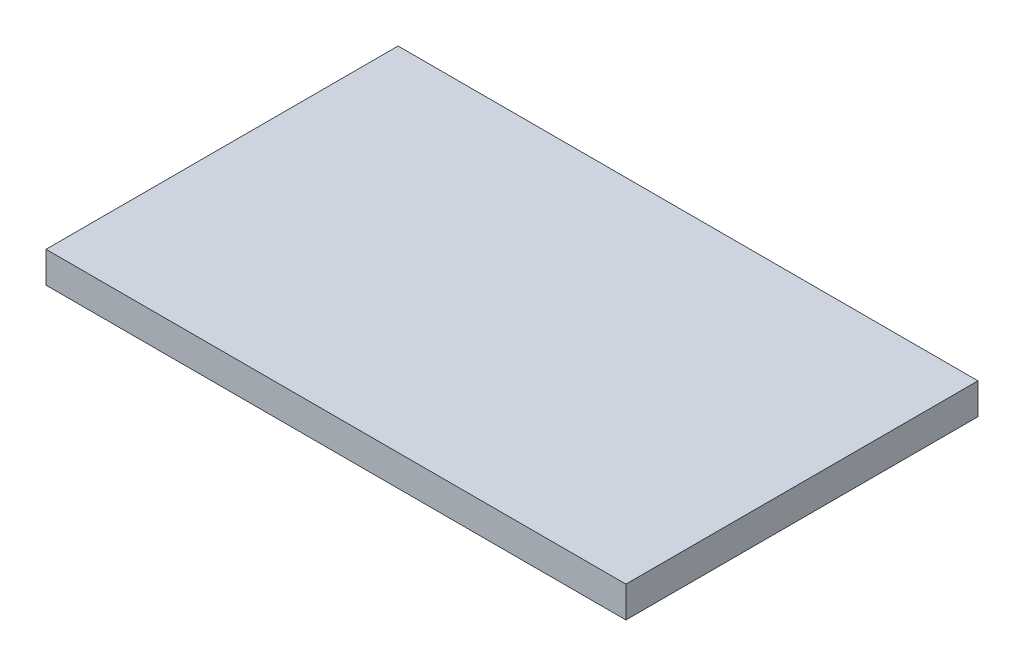
ISO-10303-21;
HEADER;
FILE_DESCRIPTION(('STEP AP214'),'2;1');
FILE_NAME('part.step','',(''),(''),'','','');
FILE_SCHEMA(('AUTOMOTIVE_DESIGN { 1 0 10303 214 1 1 1 1 }'));
ENDSEC;
DATA;
#1=APPLICATION_CONTEXT('core data for automotive mechanical design processes');
#2=APPLICATION_PROTOCOL_DEFINITION('international standard','automotive_design',2000,#1);
#3=PRODUCT_CONTEXT('',#1,'mechanical');
#4=PRODUCT('Part','Part','',(#3));
#5=PRODUCT_RELATED_PRODUCT_CATEGORY('part','',(#4));
#6=PRODUCT_DEFINITION_FORMATION('','',#4);
#7=PRODUCT_DEFINITION_CONTEXT('part definition',#1,'design');
#8=PRODUCT_DEFINITION('design','',#6,#7);
#9=PRODUCT_DEFINITION_SHAPE('','',#8);
#10=(LENGTH_UNIT() NAMED_UNIT(*) SI_UNIT(.MILLI.,.METRE.));
#11=(NAMED_UNIT(*) PLANE_ANGLE_UNIT() SI_UNIT($,.RADIAN.));
#12=(NAMED_UNIT(*) SI_UNIT($,.STERADIAN.) SOLID_ANGLE_UNIT());
#13=UNCERTAINTY_MEASURE_WITH_UNIT(LENGTH_MEASURE(1.E-05),#10,'distance_accuracy_value','');
#14=(GEOMETRIC_REPRESENTATION_CONTEXT(3) GLOBAL_UNCERTAINTY_ASSIGNED_CONTEXT((#13)) GLOBAL_UNIT_ASSIGNED_CONTEXT((#10,
#11,#12)) REPRESENTATION_CONTEXT('',''));
#15=CARTESIAN_POINT('',(0.,0.,0.));
#16=DIRECTION('',(0.,0.,1.));
#17=DIRECTION('',(1.,0.,0.));
#18=AXIS2_PLACEMENT_3D('',#15,#16,#17);
#19=CARTESIAN_POINT('',(84.,-4.5,102.));
#20=DIRECTION('',(-1.,0.,0.));
#21=DIRECTION('',(0.,0.,1.));
#22=AXIS2_PLACEMENT_3D('',#19,#20,#21);
#23=PLANE('',#22);
#24=DIRECTION('',(0.,1.,0.));
#25=VECTOR('',#24,1.);
#26=CARTESIAN_POINT('',(84.,-4.5,0.));
#27=LINE('',#26,#25);
#28=CARTESIAN_POINT('',(84.,-4.5,0.));
#29=VERTEX_POINT('',#28);
#30=CARTESIAN_POINT('',(84.,4.5,0.));
#31=VERTEX_POINT('',#30);
#32=EDGE_CURVE('E107',#29,#31,#27,.T.);
#33=ORIENTED_EDGE('',*,*,#32,.T.);
#34=DIRECTION('',(0.,0.,-1.));
#35=VECTOR('',#34,1.);
#36=CARTESIAN_POINT('',(84.,4.5,102.));
#37=LINE('',#36,#35);
#38=CARTESIAN_POINT('',(84.,4.5,102.));
#39=VERTEX_POINT('',#38);
#40=EDGE_CURVE('E11',#39,#31,#37,.T.);
#41=ORIENTED_EDGE('',*,*,#40,.F.);
#42=DIRECTION('',(0.,1.,0.));
#43=VECTOR('',#42,1.);
#44=CARTESIAN_POINT('',(84.,-4.5,102.));
#45=LINE('',#44,#43);
#46=CARTESIAN_POINT('',(84.,-4.5,102.));
#47=VERTEX_POINT('',#46);
#48=EDGE_CURVE('E94',#47,#39,#45,.T.);
#49=ORIENTED_EDGE('',*,*,#48,.F.);
#50=DIRECTION('',(0.,0.,-1.));
#51=VECTOR('',#50,1.);
#52=CARTESIAN_POINT('',(84.,-4.5,102.));
#53=LINE('',#52,#51);
#54=EDGE_CURVE('E102',#47,#29,#53,.T.);
#55=ORIENTED_EDGE('',*,*,#54,.T.);
#56=EDGE_LOOP('',(#33,#41,#49,#55));
#57=FACE_BOUND('',#56,.T.);
#58=ADVANCED_FACE('F43',(#57),#23,.F.);
#59=CARTESIAN_POINT('',(-84.,4.5,102.));
#60=DIRECTION('',(0.,-1.,0.));
#61=DIRECTION('',(0.,0.,-1.));
#62=AXIS2_PLACEMENT_3D('',#59,#60,#61);
#63=PLANE('',#62);
#64=DIRECTION('',(-1.,0.,0.));
#65=VECTOR('',#64,1.);
#66=CARTESIAN_POINT('',(-84.,4.5,0.));
#67=LINE('',#66,#65);
#68=CARTESIAN_POINT('',(-84.,4.5,0.));
#69=VERTEX_POINT('',#68);
#70=EDGE_CURVE('E97',#31,#69,#67,.T.);
#71=ORIENTED_EDGE('',*,*,#70,.T.);
#72=DIRECTION('',(0.,0.,-1.));
#73=VECTOR('',#72,1.);
#74=CARTESIAN_POINT('',(-84.,4.5,102.));
#75=LINE('',#74,#73);
#76=CARTESIAN_POINT('',(-84.,4.5,102.));
#77=VERTEX_POINT('',#76);
#78=EDGE_CURVE('E51',#77,#69,#75,.T.);
#79=ORIENTED_EDGE('',*,*,#78,.F.);
#80=DIRECTION('',(-1.,0.,0.));
#81=VECTOR('',#80,1.);
#82=CARTESIAN_POINT('',(-84.,4.5,102.));
#83=LINE('',#82,#81);
#84=EDGE_CURVE('E90',#39,#77,#83,.T.);
#85=ORIENTED_EDGE('',*,*,#84,.F.);
#86=ORIENTED_EDGE('',*,*,#40,.T.);
#87=EDGE_LOOP('',(#71,#79,#85,#86));
#88=FACE_BOUND('',#87,.T.);
#89=ADVANCED_FACE('F98',(#88),#63,.F.);
#90=CARTESIAN_POINT('',(-84.,-4.5,102.));
#91=DIRECTION('',(1.,0.,0.));
#92=DIRECTION('',(0.,0.,-1.));
#93=AXIS2_PLACEMENT_3D('',#90,#91,#92);
#94=PLANE('',#93);
#95=DIRECTION('',(0.,-1.,0.));
#96=VECTOR('',#95,1.);
#97=CARTESIAN_POINT('',(-84.,-4.5,0.));
#98=LINE('',#97,#96);
#99=CARTESIAN_POINT('',(-84.,-4.5,0.));
#100=VERTEX_POINT('',#99);
#101=EDGE_CURVE('E78',#69,#100,#98,.T.);
#102=ORIENTED_EDGE('',*,*,#101,.T.);
#103=DIRECTION('',(0.,0.,-1.));
#104=VECTOR('',#103,1.);
#105=CARTESIAN_POINT('',(-84.,-4.5,102.));
#106=LINE('',#105,#104);
#107=CARTESIAN_POINT('',(-84.,-4.5,102.));
#108=VERTEX_POINT('',#107);
#109=EDGE_CURVE('E99',#108,#100,#106,.T.);
#110=ORIENTED_EDGE('',*,*,#109,.F.);
#111=DIRECTION('',(0.,-1.,0.));
#112=VECTOR('',#111,1.);
#113=CARTESIAN_POINT('',(-84.,-4.5,102.));
#114=LINE('',#113,#112);
#115=EDGE_CURVE('E95',#77,#108,#114,.T.);
#116=ORIENTED_EDGE('',*,*,#115,.F.);
#117=ORIENTED_EDGE('',*,*,#78,.T.);
#118=EDGE_LOOP('',(#102,#110,#116,#117));
#119=FACE_BOUND('',#118,.T.);
#120=ADVANCED_FACE('F101',(#119),#94,.F.);
#121=CARTESIAN_POINT('',(-84.,-4.5,102.));
#122=DIRECTION('',(0.,1.,0.));
#123=DIRECTION('',(0.,0.,1.));
#124=AXIS2_PLACEMENT_3D('',#121,#122,#123);
#125=PLANE('',#124);
#126=DIRECTION('',(1.,0.,0.));
#127=VECTOR('',#126,1.);
#128=CARTESIAN_POINT('',(-84.,-4.5,0.));
#129=LINE('',#128,#127);
#130=EDGE_CURVE('E85',#100,#29,#129,.T.);
#131=ORIENTED_EDGE('',*,*,#130,.T.);
#132=ORIENTED_EDGE('',*,*,#54,.F.);
#133=DIRECTION('',(1.,0.,0.));
#134=VECTOR('',#133,1.);
#135=CARTESIAN_POINT('',(-84.,-4.5,102.));
#136=LINE('',#135,#134);
#137=EDGE_CURVE('E56',#108,#47,#136,.T.);
#138=ORIENTED_EDGE('',*,*,#137,.F.);
#139=ORIENTED_EDGE('',*,*,#109,.T.);
#140=EDGE_LOOP('',(#131,#132,#138,#139));
#141=FACE_BOUND('',#140,.T.);
#142=ADVANCED_FACE('F113',(#141),#125,.F.);
#143=CARTESIAN_POINT('',(0.,0.,102.));
#144=DIRECTION('',(0.,0.,-1.));
#145=DIRECTION('',(-1.,0.,0.));
#146=AXIS2_PLACEMENT_3D('',#143,#144,#145);
#147=PLANE('',#146);
#148=ORIENTED_EDGE('',*,*,#48,.T.);
#149=ORIENTED_EDGE('',*,*,#84,.T.);
#150=ORIENTED_EDGE('',*,*,#115,.T.);
#151=ORIENTED_EDGE('',*,*,#137,.T.);
#152=EDGE_LOOP('',(#148,#149,#150,#151));
#153=FACE_BOUND('',#152,.T.);
#154=ADVANCED_FACE('F89',(#153),#147,.F.);
#155=CARTESIAN_POINT('',(0.,0.,0.));
#156=DIRECTION('',(0.,0.,-1.));
#157=DIRECTION('',(-1.,0.,0.));
#158=AXIS2_PLACEMENT_3D('',#155,#156,#157);
#159=PLANE('',#158);
#160=ORIENTED_EDGE('',*,*,#32,.F.);
#161=ORIENTED_EDGE('',*,*,#130,.F.);
#162=ORIENTED_EDGE('',*,*,#101,.F.);
#163=ORIENTED_EDGE('',*,*,#70,.F.);
#164=EDGE_LOOP('',(#160,#161,#162,#163));
#165=FACE_BOUND('',#164,.T.);
#166=ADVANCED_FACE('F116',(#165),#159,.T.);
#167=CLOSED_SHELL('',(#58,#89,#120,#142,#154,#166));
#168=MANIFOLD_SOLID_BREP('B2',#167);
#169=ADVANCED_BREP_SHAPE_REPRESENTATION('',(#18,#168),#14);
#170=SHAPE_DEFINITION_REPRESENTATION(#9,#169);
ENDSEC;
END-ISO-10303-21;
